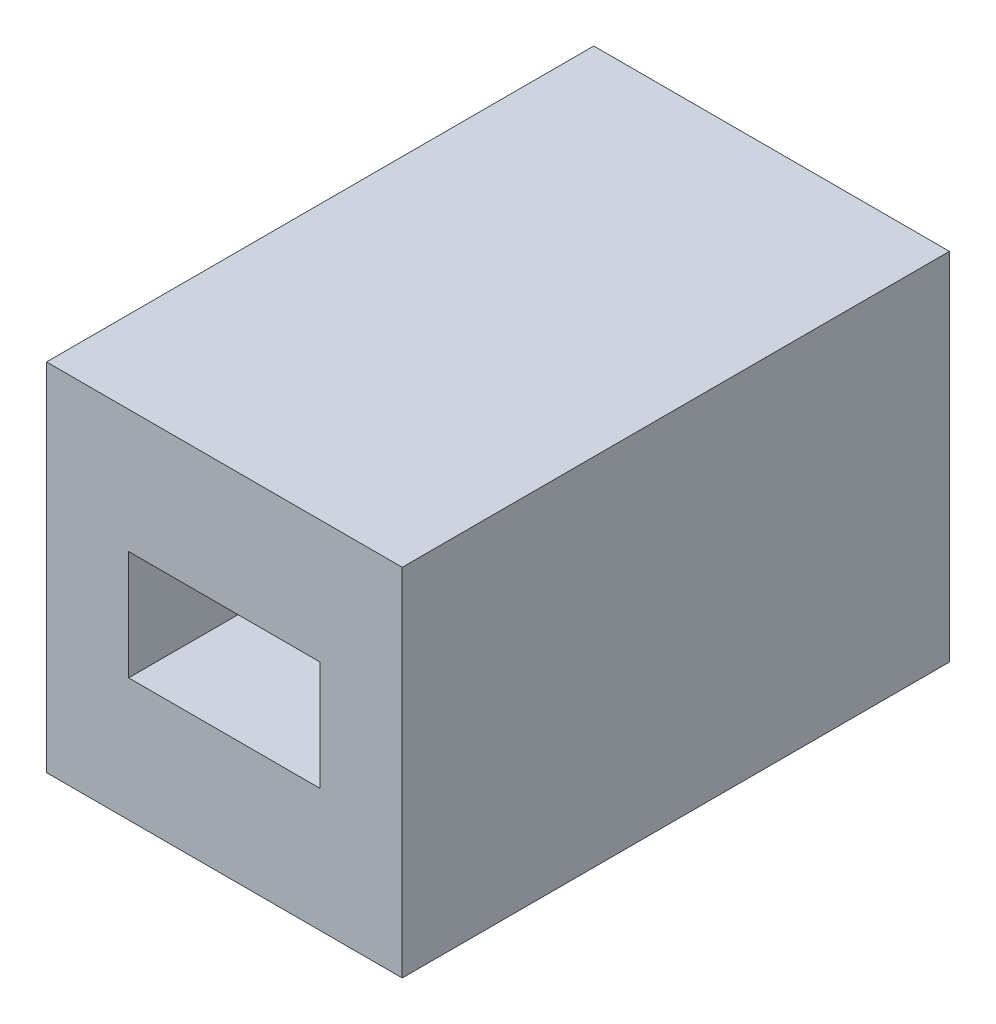
ISO-10303-21;
HEADER;
FILE_DESCRIPTION(('STEP AP214'),'2;1');
FILE_NAME('part.step','',(''),(''),'','','');
FILE_SCHEMA(('AUTOMOTIVE_DESIGN { 1 0 10303 214 1 1 1 1 }'));
ENDSEC;
DATA;
#1=APPLICATION_CONTEXT('core data for automotive mechanical design processes');
#2=APPLICATION_PROTOCOL_DEFINITION('international standard','automotive_design',2000,#1);
#3=PRODUCT_CONTEXT('',#1,'mechanical');
#4=PRODUCT('Part','Part','',(#3));
#5=PRODUCT_RELATED_PRODUCT_CATEGORY('part','',(#4));
#6=PRODUCT_DEFINITION_FORMATION('','',#4);
#7=PRODUCT_DEFINITION_CONTEXT('part definition',#1,'design');
#8=PRODUCT_DEFINITION('design','',#6,#7);
#9=PRODUCT_DEFINITION_SHAPE('','',#8);
#10=(LENGTH_UNIT() NAMED_UNIT(*) SI_UNIT(.MILLI.,.METRE.));
#11=(NAMED_UNIT(*) PLANE_ANGLE_UNIT() SI_UNIT($,.RADIAN.));
#12=(NAMED_UNIT(*) SI_UNIT($,.STERADIAN.) SOLID_ANGLE_UNIT());
#13=UNCERTAINTY_MEASURE_WITH_UNIT(LENGTH_MEASURE(1.E-05),#10,'distance_accuracy_value','');
#14=(GEOMETRIC_REPRESENTATION_CONTEXT(3) GLOBAL_UNCERTAINTY_ASSIGNED_CONTEXT((#13)) GLOBAL_UNIT_ASSIGNED_CONTEXT((#10,
#11,#12)) REPRESENTATION_CONTEXT('',''));
#15=CARTESIAN_POINT('',(0.,0.,0.));
#16=DIRECTION('',(0.,0.,1.));
#17=DIRECTION('',(1.,0.,0.));
#18=AXIS2_PLACEMENT_3D('',#15,#16,#17);
#19=CARTESIAN_POINT('',(0.,0.,200.));
#20=DIRECTION('',(0.,0.,1.));
#21=DIRECTION('',(1.,0.,0.));
#22=AXIS2_PLACEMENT_3D('',#19,#20,#21);
#23=PLANE('',#22);
#24=DIRECTION('',(0.,-1.,0.));
#25=VECTOR('',#24,1.);
#26=CARTESIAN_POINT('',(-65.,65.,200.));
#27=LINE('',#26,#25);
#28=CARTESIAN_POINT('',(-65.,65.,200.));
#29=VERTEX_POINT('',#28);
#30=CARTESIAN_POINT('',(-65.,-65.,200.));
#31=VERTEX_POINT('',#30);
#32=EDGE_CURVE('E133',#29,#31,#27,.T.);
#33=ORIENTED_EDGE('',*,*,#32,.T.);
#34=DIRECTION('',(1.,0.,0.));
#35=VECTOR('',#34,1.);
#36=CARTESIAN_POINT('',(-65.,-65.,200.));
#37=LINE('',#36,#35);
#38=CARTESIAN_POINT('',(65.,-65.,200.));
#39=VERTEX_POINT('',#38);
#40=EDGE_CURVE('E136',#31,#39,#37,.T.);
#41=ORIENTED_EDGE('',*,*,#40,.T.);
#42=DIRECTION('',(0.,1.,0.));
#43=VECTOR('',#42,1.);
#44=CARTESIAN_POINT('',(65.,65.,200.));
#45=LINE('',#44,#43);
#46=CARTESIAN_POINT('',(65.,65.,200.));
#47=VERTEX_POINT('',#46);
#48=EDGE_CURVE('E139',#39,#47,#45,.T.);
#49=ORIENTED_EDGE('',*,*,#48,.T.);
#50=DIRECTION('',(-1.,0.,0.));
#51=VECTOR('',#50,1.);
#52=CARTESIAN_POINT('',(-65.,65.,200.));
#53=LINE('',#52,#51);
#54=EDGE_CURVE('E141',#47,#29,#53,.T.);
#55=ORIENTED_EDGE('',*,*,#54,.T.);
#56=EDGE_LOOP('',(#33,#41,#49,#55));
#57=FACE_BOUND('',#56,.T.);
#58=DIRECTION('',(1.,0.,0.));
#59=VECTOR('',#58,1.);
#60=CARTESIAN_POINT('',(-35.,-20.,200.));
#61=LINE('',#60,#59);
#62=CARTESIAN_POINT('',(-35.,-20.,200.));
#63=VERTEX_POINT('',#62);
#64=CARTESIAN_POINT('',(35.,-20.,200.));
#65=VERTEX_POINT('',#64);
#66=EDGE_CURVE('E105',#63,#65,#61,.T.);
#67=ORIENTED_EDGE('',*,*,#66,.F.);
#68=DIRECTION('',(0.,-1.,0.));
#69=VECTOR('',#68,1.);
#70=CARTESIAN_POINT('',(-35.,20.,200.));
#71=LINE('',#70,#69);
#72=CARTESIAN_POINT('',(-35.,20.,200.));
#73=VERTEX_POINT('',#72);
#74=EDGE_CURVE('E97',#73,#63,#71,.T.);
#75=ORIENTED_EDGE('',*,*,#74,.F.);
#76=DIRECTION('',(-1.,0.,0.));
#77=VECTOR('',#76,1.);
#78=CARTESIAN_POINT('',(-35.,20.,200.));
#79=LINE('',#78,#77);
#80=CARTESIAN_POINT('',(35.,20.,200.));
#81=VERTEX_POINT('',#80);
#82=EDGE_CURVE('E119',#81,#73,#79,.T.);
#83=ORIENTED_EDGE('',*,*,#82,.F.);
#84=DIRECTION('',(0.,1.,0.));
#85=VECTOR('',#84,1.);
#86=CARTESIAN_POINT('',(35.,20.,200.));
#87=LINE('',#86,#85);
#88=EDGE_CURVE('E117',#65,#81,#87,.T.);
#89=ORIENTED_EDGE('',*,*,#88,.F.);
#90=EDGE_LOOP('',(#67,#75,#83,#89));
#91=FACE_BOUND('',#90,.T.);
#92=ADVANCED_FACE('F32',(#57,#91),#23,.T.);
#93=CARTESIAN_POINT('',(0.,0.,0.));
#94=DIRECTION('',(0.,0.,1.));
#95=DIRECTION('',(1.,0.,0.));
#96=AXIS2_PLACEMENT_3D('',#93,#94,#95);
#97=PLANE('',#96);
#98=DIRECTION('',(0.,-1.,0.));
#99=VECTOR('',#98,1.);
#100=CARTESIAN_POINT('',(-65.,65.,0.));
#101=LINE('',#100,#99);
#102=CARTESIAN_POINT('',(-65.,65.,0.));
#103=VERTEX_POINT('',#102);
#104=CARTESIAN_POINT('',(-65.,-65.,0.));
#105=VERTEX_POINT('',#104);
#106=EDGE_CURVE('E113',#103,#105,#101,.T.);
#107=ORIENTED_EDGE('',*,*,#106,.F.);
#108=DIRECTION('',(-1.,0.,0.));
#109=VECTOR('',#108,1.);
#110=CARTESIAN_POINT('',(-65.,65.,0.));
#111=LINE('',#110,#109);
#112=CARTESIAN_POINT('',(65.,65.,0.));
#113=VERTEX_POINT('',#112);
#114=EDGE_CURVE('E137',#113,#103,#111,.T.);
#115=ORIENTED_EDGE('',*,*,#114,.F.);
#116=DIRECTION('',(0.,1.,0.));
#117=VECTOR('',#116,1.);
#118=CARTESIAN_POINT('',(65.,65.,0.));
#119=LINE('',#118,#117);
#120=CARTESIAN_POINT('',(65.,-65.,0.));
#121=VERTEX_POINT('',#120);
#122=EDGE_CURVE('E148',#121,#113,#119,.T.);
#123=ORIENTED_EDGE('',*,*,#122,.F.);
#124=DIRECTION('',(1.,0.,0.));
#125=VECTOR('',#124,1.);
#126=CARTESIAN_POINT('',(-65.,-65.,0.));
#127=LINE('',#126,#125);
#128=EDGE_CURVE('E146',#105,#121,#127,.T.);
#129=ORIENTED_EDGE('',*,*,#128,.F.);
#130=EDGE_LOOP('',(#107,#115,#123,#129));
#131=FACE_BOUND('',#130,.T.);
#132=DIRECTION('',(0.,-1.,0.));
#133=VECTOR('',#132,1.);
#134=CARTESIAN_POINT('',(-35.,20.,0.));
#135=LINE('',#134,#133);
#136=CARTESIAN_POINT('',(-35.,20.,0.));
#137=VERTEX_POINT('',#136);
#138=CARTESIAN_POINT('',(-35.,-20.,0.));
#139=VERTEX_POINT('',#138);
#140=EDGE_CURVE('E55',#137,#139,#135,.T.);
#141=ORIENTED_EDGE('',*,*,#140,.T.);
#142=DIRECTION('',(1.,0.,0.));
#143=VECTOR('',#142,1.);
#144=CARTESIAN_POINT('',(-35.,-20.,0.));
#145=LINE('',#144,#143);
#146=CARTESIAN_POINT('',(35.,-20.,0.));
#147=VERTEX_POINT('',#146);
#148=EDGE_CURVE('E112',#139,#147,#145,.T.);
#149=ORIENTED_EDGE('',*,*,#148,.T.);
#150=DIRECTION('',(0.,1.,0.));
#151=VECTOR('',#150,1.);
#152=CARTESIAN_POINT('',(35.,20.,0.));
#153=LINE('',#152,#151);
#154=CARTESIAN_POINT('',(35.,20.,0.));
#155=VERTEX_POINT('',#154);
#156=EDGE_CURVE('E125',#147,#155,#153,.T.);
#157=ORIENTED_EDGE('',*,*,#156,.T.);
#158=DIRECTION('',(-1.,0.,0.));
#159=VECTOR('',#158,1.);
#160=CARTESIAN_POINT('',(-35.,20.,0.));
#161=LINE('',#160,#159);
#162=EDGE_CURVE('E106',#155,#137,#161,.T.);
#163=ORIENTED_EDGE('',*,*,#162,.T.);
#164=EDGE_LOOP('',(#141,#149,#157,#163));
#165=FACE_BOUND('',#164,.T.);
#166=ADVANCED_FACE('F166',(#131,#165),#97,.F.);
#167=CARTESIAN_POINT('',(-65.,65.,200.));
#168=DIRECTION('',(1.,0.,0.));
#169=DIRECTION('',(0.,0.,-1.));
#170=AXIS2_PLACEMENT_3D('',#167,#168,#169);
#171=PLANE('',#170);
#172=ORIENTED_EDGE('',*,*,#106,.T.);
#173=DIRECTION('',(0.,0.,-1.));
#174=VECTOR('',#173,1.);
#175=CARTESIAN_POINT('',(-65.,-65.,200.));
#176=LINE('',#175,#174);
#177=EDGE_CURVE('E11',#31,#105,#176,.T.);
#178=ORIENTED_EDGE('',*,*,#177,.F.);
#179=ORIENTED_EDGE('',*,*,#32,.F.);
#180=DIRECTION('',(0.,0.,-1.));
#181=VECTOR('',#180,1.);
#182=CARTESIAN_POINT('',(-65.,65.,200.));
#183=LINE('',#182,#181);
#184=EDGE_CURVE('E143',#29,#103,#183,.T.);
#185=ORIENTED_EDGE('',*,*,#184,.T.);
#186=EDGE_LOOP('',(#172,#178,#179,#185));
#187=FACE_BOUND('',#186,.T.);
#188=ADVANCED_FACE('F34',(#187),#171,.F.);
#189=CARTESIAN_POINT('',(-65.,-65.,200.));
#190=DIRECTION('',(0.,1.,0.));
#191=DIRECTION('',(0.,0.,1.));
#192=AXIS2_PLACEMENT_3D('',#189,#190,#191);
#193=PLANE('',#192);
#194=ORIENTED_EDGE('',*,*,#128,.T.);
#195=DIRECTION('',(0.,0.,-1.));
#196=VECTOR('',#195,1.);
#197=CARTESIAN_POINT('',(65.,-65.,200.));
#198=LINE('',#197,#196);
#199=EDGE_CURVE('E40',#39,#121,#198,.T.);
#200=ORIENTED_EDGE('',*,*,#199,.F.);
#201=ORIENTED_EDGE('',*,*,#40,.F.);
#202=ORIENTED_EDGE('',*,*,#177,.T.);
#203=EDGE_LOOP('',(#194,#200,#201,#202));
#204=FACE_BOUND('',#203,.T.);
#205=ADVANCED_FACE('F176',(#204),#193,.F.);
#206=CARTESIAN_POINT('',(65.,65.,200.));
#207=DIRECTION('',(-1.,0.,0.));
#208=DIRECTION('',(0.,0.,1.));
#209=AXIS2_PLACEMENT_3D('',#206,#207,#208);
#210=PLANE('',#209);
#211=ORIENTED_EDGE('',*,*,#122,.T.);
#212=DIRECTION('',(0.,0.,-1.));
#213=VECTOR('',#212,1.);
#214=CARTESIAN_POINT('',(65.,65.,200.));
#215=LINE('',#214,#213);
#216=EDGE_CURVE('E153',#47,#113,#215,.T.);
#217=ORIENTED_EDGE('',*,*,#216,.F.);
#218=ORIENTED_EDGE('',*,*,#48,.F.);
#219=ORIENTED_EDGE('',*,*,#199,.T.);
#220=EDGE_LOOP('',(#211,#217,#218,#219));
#221=FACE_BOUND('',#220,.T.);
#222=ADVANCED_FACE('F160',(#221),#210,.F.);
#223=CARTESIAN_POINT('',(-65.,65.,200.));
#224=DIRECTION('',(0.,-1.,0.));
#225=DIRECTION('',(0.,0.,-1.));
#226=AXIS2_PLACEMENT_3D('',#223,#224,#225);
#227=PLANE('',#226);
#228=ORIENTED_EDGE('',*,*,#114,.T.);
#229=ORIENTED_EDGE('',*,*,#184,.F.);
#230=ORIENTED_EDGE('',*,*,#54,.F.);
#231=ORIENTED_EDGE('',*,*,#216,.T.);
#232=EDGE_LOOP('',(#228,#229,#230,#231));
#233=FACE_BOUND('',#232,.T.);
#234=ADVANCED_FACE('F170',(#233),#227,.F.);
#235=CARTESIAN_POINT('',(-35.,20.,200.));
#236=DIRECTION('',(1.,0.,0.));
#237=DIRECTION('',(0.,1.,0.));
#238=AXIS2_PLACEMENT_3D('',#235,#236,#237);
#239=PLANE('',#238);
#240=ORIENTED_EDGE('',*,*,#140,.F.);
#241=DIRECTION('',(0.,0.,-1.));
#242=VECTOR('',#241,1.);
#243=CARTESIAN_POINT('',(-35.,20.,200.));
#244=LINE('',#243,#242);
#245=EDGE_CURVE('E101',#73,#137,#244,.T.);
#246=ORIENTED_EDGE('',*,*,#245,.F.);
#247=ORIENTED_EDGE('',*,*,#74,.T.);
#248=DIRECTION('',(0.,0.,-1.));
#249=VECTOR('',#248,1.);
#250=CARTESIAN_POINT('',(-35.,-20.,200.));
#251=LINE('',#250,#249);
#252=EDGE_CURVE('E100',#63,#139,#251,.T.);
#253=ORIENTED_EDGE('',*,*,#252,.T.);
#254=EDGE_LOOP('',(#240,#246,#247,#253));
#255=FACE_BOUND('',#254,.T.);
#256=ADVANCED_FACE('F99',(#255),#239,.T.);
#257=CARTESIAN_POINT('',(-35.,-20.,200.));
#258=DIRECTION('',(0.,1.,0.));
#259=DIRECTION('',(0.,0.,1.));
#260=AXIS2_PLACEMENT_3D('',#257,#258,#259);
#261=PLANE('',#260);
#262=ORIENTED_EDGE('',*,*,#148,.F.);
#263=ORIENTED_EDGE('',*,*,#252,.F.);
#264=ORIENTED_EDGE('',*,*,#66,.T.);
#265=DIRECTION('',(0.,0.,-1.));
#266=VECTOR('',#265,1.);
#267=CARTESIAN_POINT('',(35.,-20.,200.));
#268=LINE('',#267,#266);
#269=EDGE_CURVE('E114',#65,#147,#268,.T.);
#270=ORIENTED_EDGE('',*,*,#269,.T.);
#271=EDGE_LOOP('',(#262,#263,#264,#270));
#272=FACE_BOUND('',#271,.T.);
#273=ADVANCED_FACE('F109',(#272),#261,.T.);
#274=CARTESIAN_POINT('',(35.,20.,200.));
#275=DIRECTION('',(-1.,0.,0.));
#276=DIRECTION('',(0.,-1.,0.));
#277=AXIS2_PLACEMENT_3D('',#274,#275,#276);
#278=PLANE('',#277);
#279=ORIENTED_EDGE('',*,*,#156,.F.);
#280=ORIENTED_EDGE('',*,*,#269,.F.);
#281=ORIENTED_EDGE('',*,*,#88,.T.);
#282=DIRECTION('',(0.,0.,-1.));
#283=VECTOR('',#282,1.);
#284=CARTESIAN_POINT('',(35.,20.,200.));
#285=LINE('',#284,#283);
#286=EDGE_CURVE('E47',#81,#155,#285,.T.);
#287=ORIENTED_EDGE('',*,*,#286,.T.);
#288=EDGE_LOOP('',(#279,#280,#281,#287));
#289=FACE_BOUND('',#288,.T.);
#290=ADVANCED_FACE('F199',(#289),#278,.T.);
#291=CARTESIAN_POINT('',(-35.,20.,200.));
#292=DIRECTION('',(0.,-1.,0.));
#293=DIRECTION('',(1.,0.,0.));
#294=AXIS2_PLACEMENT_3D('',#291,#292,#293);
#295=PLANE('',#294);
#296=ORIENTED_EDGE('',*,*,#162,.F.);
#297=ORIENTED_EDGE('',*,*,#286,.F.);
#298=ORIENTED_EDGE('',*,*,#82,.T.);
#299=ORIENTED_EDGE('',*,*,#245,.T.);
#300=EDGE_LOOP('',(#296,#297,#298,#299));
#301=FACE_BOUND('',#300,.T.);
#302=ADVANCED_FACE('F203',(#301),#295,.T.);
#303=CLOSED_SHELL('',(#92,#166,#188,#205,#222,#234,#256,#273,#290,#302));
#304=MANIFOLD_SOLID_BREP('B2',#303);
#305=ADVANCED_BREP_SHAPE_REPRESENTATION('',(#18,#304),#14);
#306=SHAPE_DEFINITION_REPRESENTATION(#9,#305);
ENDSEC;
END-ISO-10303-21;
